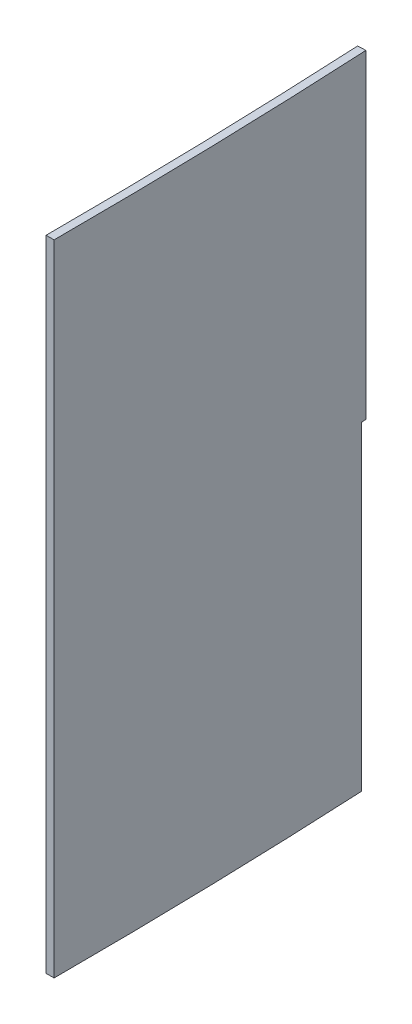
ISO-10303-21;
HEADER;
FILE_DESCRIPTION(('STEP AP214'),'2;1');
FILE_NAME('part.step','',(''),(''),'','','');
FILE_SCHEMA(('AUTOMOTIVE_DESIGN { 1 0 10303 214 1 1 1 1 }'));
ENDSEC;
DATA;
#1=APPLICATION_CONTEXT('core data for automotive mechanical design processes');
#2=APPLICATION_PROTOCOL_DEFINITION('international standard','automotive_design',2000,#1);
#3=PRODUCT_CONTEXT('',#1,'mechanical');
#4=PRODUCT('Part','Part','',(#3));
#5=PRODUCT_RELATED_PRODUCT_CATEGORY('part','',(#4));
#6=PRODUCT_DEFINITION_FORMATION('','',#4);
#7=PRODUCT_DEFINITION_CONTEXT('part definition',#1,'design');
#8=PRODUCT_DEFINITION('design','',#6,#7);
#9=PRODUCT_DEFINITION_SHAPE('','',#8);
#10=(LENGTH_UNIT() NAMED_UNIT(*) SI_UNIT(.MILLI.,.METRE.));
#11=(NAMED_UNIT(*) PLANE_ANGLE_UNIT() SI_UNIT($,.RADIAN.));
#12=(NAMED_UNIT(*) SI_UNIT($,.STERADIAN.) SOLID_ANGLE_UNIT());
#13=UNCERTAINTY_MEASURE_WITH_UNIT(LENGTH_MEASURE(1.E-05),#10,'distance_accuracy_value','');
#14=(GEOMETRIC_REPRESENTATION_CONTEXT(3) GLOBAL_UNCERTAINTY_ASSIGNED_CONTEXT((#13)) GLOBAL_UNIT_ASSIGNED_CONTEXT((#10,
#11,#12)) REPRESENTATION_CONTEXT('',''));
#15=CARTESIAN_POINT('',(0.,0.,0.));
#16=DIRECTION('',(0.,0.,1.));
#17=DIRECTION('',(1.,0.,0.));
#18=AXIS2_PLACEMENT_3D('',#15,#16,#17);
#19=CARTESIAN_POINT('',(0.,10.,0.));
#20=DIRECTION('',(0.,1.,0.));
#21=DIRECTION('',(0.,0.,1.));
#22=AXIS2_PLACEMENT_3D('',#19,#20,#21);
#23=PLANE('',#22);
#24=DIRECTION('',(-0.998690936139058,0.,0.0511508951406651));
#25=VECTOR('',#24,1.);
#26=CARTESIAN_POINT('',(195.244078015186,10.,-10.));
#27=LINE('',#26,#25);
#28=CARTESIAN_POINT('',(195.493750749221,10.,-10.0127877237851));
#29=VERTEX_POINT('',#28);
#30=CARTESIAN_POINT('',(195.244078015186,10.,-10.));
#31=VERTEX_POINT('',#30);
#32=EDGE_CURVE('E11',#29,#31,#27,.T.);
#33=ORIENTED_EDGE('',*,*,#32,.F.);
#34=CARTESIAN_POINT('',(0.,10.,0.));
#35=DIRECTION('',(0.,-1.,0.));
#36=DIRECTION('',(0.,0.,-1.));
#37=AXIS2_PLACEMENT_3D('',#34,#35,#36);
#38=CIRCLE('',#37,195.75);
#39=CARTESIAN_POINT('',(195.50137081598,10.,-9.86288543341248));
#40=VERTEX_POINT('',#39);
#41=EDGE_CURVE('E81',#29,#40,#38,.T.);
#42=ORIENTED_EDGE('',*,*,#41,.T.);
#43=DIRECTION('',(-0.998729863683168,0.,0.050385110770945));
#44=VECTOR('',#43,1.);
#45=CARTESIAN_POINT('',(195.251688350059,10.,-9.85028915571977));
#46=LINE('',#45,#44);
#47=CARTESIAN_POINT('',(195.251688350059,10.,-9.85028915571977));
#48=VERTEX_POINT('',#47);
#49=EDGE_CURVE('E49',#40,#48,#46,.T.);
#50=ORIENTED_EDGE('',*,*,#49,.T.);
#51=CARTESIAN_POINT('',(0.,10.,0.));
#52=DIRECTION('',(0.,-1.,0.));
#53=DIRECTION('',(0.,0.,1.));
#54=AXIS2_PLACEMENT_3D('',#51,#52,#53);
#55=CIRCLE('',#54,195.5);
#56=EDGE_CURVE('E84',#31,#48,#55,.T.);
#57=ORIENTED_EDGE('',*,*,#56,.F.);
#58=EDGE_LOOP('',(#33,#42,#50,#57));
#59=FACE_BOUND('',#58,.T.);
#60=ADVANCED_FACE('F39',(#59),#23,.F.);
#61=CARTESIAN_POINT('',(195.251688350059,5.,-9.85028915571976));
#62=DIRECTION('',(0.050385110770945,0.,0.998729863683168));
#63=DIRECTION('',(0.,-1.,0.));
#64=AXIS2_PLACEMENT_3D('',#61,#62,#63);
#65=PLANE('',#64);
#66=ORIENTED_EDGE('',*,*,#49,.F.);
#67=DIRECTION('',(0.,-1.,0.));
#68=VECTOR('',#67,1.);
#69=CARTESIAN_POINT('',(195.50137081598,32.3668921744843,-9.86288543341248));
#70=LINE('',#69,#68);
#71=CARTESIAN_POINT('',(195.50137081598,0.,-9.86288543341248));
#72=VERTEX_POINT('',#71);
#73=EDGE_CURVE('E97',#40,#72,#70,.T.);
#74=ORIENTED_EDGE('',*,*,#73,.T.);
#75=DIRECTION('',(-0.998729863683168,0.,0.050385110770945));
#76=VECTOR('',#75,1.);
#77=CARTESIAN_POINT('',(195.251688350059,0.,-9.85028915571976));
#78=LINE('',#77,#76);
#79=CARTESIAN_POINT('',(195.251688350059,0.,-9.85028915571976));
#80=VERTEX_POINT('',#79);
#81=EDGE_CURVE('E112',#72,#80,#78,.T.);
#82=ORIENTED_EDGE('',*,*,#81,.T.);
#83=DIRECTION('',(0.,-1.,0.));
#84=VECTOR('',#83,1.);
#85=CARTESIAN_POINT('',(195.251688350059,0.,-9.85028915571976));
#86=LINE('',#85,#84);
#87=EDGE_CURVE('E101',#48,#80,#86,.T.);
#88=ORIENTED_EDGE('',*,*,#87,.F.);
#89=EDGE_LOOP('',(#66,#74,#82,#88));
#90=FACE_BOUND('',#89,.T.);
#91=ADVANCED_FACE('F126',(#90),#65,.F.);
#92=CARTESIAN_POINT('',(0.,0.,0.));
#93=DIRECTION('',(0.,1.,0.));
#94=DIRECTION('',(0.,0.,1.));
#95=AXIS2_PLACEMENT_3D('',#92,#93,#94);
#96=PLANE('',#95);
#97=ORIENTED_EDGE('',*,*,#81,.F.);
#98=CARTESIAN_POINT('',(0.,0.,0.));
#99=DIRECTION('',(0.,-1.,0.));
#100=DIRECTION('',(0.,0.,-1.));
#101=AXIS2_PLACEMENT_3D('',#98,#99,#100);
#102=CIRCLE('',#101,195.75);
#103=CARTESIAN_POINT('',(195.75,0.,0.));
#104=VERTEX_POINT('',#103);
#105=EDGE_CURVE('E139',#72,#104,#102,.T.);
#106=ORIENTED_EDGE('',*,*,#105,.T.);
#107=DIRECTION('',(-1.,0.,0.));
#108=VECTOR('',#107,1.);
#109=CARTESIAN_POINT('',(195.5,0.,0.));
#110=LINE('',#109,#108);
#111=CARTESIAN_POINT('',(195.5,0.,0.));
#112=VERTEX_POINT('',#111);
#113=EDGE_CURVE('E109',#104,#112,#110,.T.);
#114=ORIENTED_EDGE('',*,*,#113,.T.);
#115=CARTESIAN_POINT('',(0.,0.,0.));
#116=DIRECTION('',(0.,-1.,0.));
#117=DIRECTION('',(0.,0.,-1.));
#118=AXIS2_PLACEMENT_3D('',#115,#116,#117);
#119=CIRCLE('',#118,195.5);
#120=EDGE_CURVE('E127',#80,#112,#119,.T.);
#121=ORIENTED_EDGE('',*,*,#120,.F.);
#122=EDGE_LOOP('',(#97,#106,#114,#121));
#123=FACE_BOUND('',#122,.T.);
#124=ADVANCED_FACE('F142',(#123),#96,.F.);
#125=CARTESIAN_POINT('',(195.5,10.,0.));
#126=DIRECTION('',(0.,0.,-1.));
#127=DIRECTION('',(0.,1.,0.));
#128=AXIS2_PLACEMENT_3D('',#125,#126,#127);
#129=PLANE('',#128);
#130=ORIENTED_EDGE('',*,*,#113,.F.);
#131=DIRECTION('',(0.,-1.,0.));
#132=VECTOR('',#131,1.);
#133=CARTESIAN_POINT('',(195.75,32.3668921744843,0.));
#134=LINE('',#133,#132);
#135=CARTESIAN_POINT('',(195.75,20.,0.));
#136=VERTEX_POINT('',#135);
#137=EDGE_CURVE('E103',#104,#136,#134,.F.);
#138=ORIENTED_EDGE('',*,*,#137,.T.);
#139=DIRECTION('',(-1.,0.,0.));
#140=VECTOR('',#139,1.);
#141=CARTESIAN_POINT('',(195.5,20.,0.));
#142=LINE('',#141,#140);
#143=CARTESIAN_POINT('',(195.5,20.,0.));
#144=VERTEX_POINT('',#143);
#145=EDGE_CURVE('E107',#136,#144,#142,.T.);
#146=ORIENTED_EDGE('',*,*,#145,.T.);
#147=DIRECTION('',(0.,1.,0.));
#148=VECTOR('',#147,1.);
#149=CARTESIAN_POINT('',(195.5,0.,0.));
#150=LINE('',#149,#148);
#151=EDGE_CURVE('E129',#112,#144,#150,.T.);
#152=ORIENTED_EDGE('',*,*,#151,.F.);
#153=EDGE_LOOP('',(#130,#138,#146,#152));
#154=FACE_BOUND('',#153,.T.);
#155=ADVANCED_FACE('F145',(#154),#129,.F.);
#156=CARTESIAN_POINT('',(0.,20.,0.));
#157=DIRECTION('',(0.,-1.,0.));
#158=DIRECTION('',(0.,0.,-1.));
#159=AXIS2_PLACEMENT_3D('',#156,#157,#158);
#160=PLANE('',#159);
#161=ORIENTED_EDGE('',*,*,#145,.F.);
#162=CARTESIAN_POINT('',(0.,20.,0.));
#163=DIRECTION('',(0.,-1.,0.));
#164=DIRECTION('',(0.,0.,-1.));
#165=AXIS2_PLACEMENT_3D('',#162,#163,#164);
#166=CIRCLE('',#165,195.75);
#167=CARTESIAN_POINT('',(195.493750749221,20.,-10.0127877237851));
#168=VERTEX_POINT('',#167);
#169=EDGE_CURVE('E99',#136,#168,#166,.F.);
#170=ORIENTED_EDGE('',*,*,#169,.T.);
#171=DIRECTION('',(-0.998690936139058,0.,0.0511508951406649));
#172=VECTOR('',#171,1.);
#173=CARTESIAN_POINT('',(195.244078015186,20.,-10.));
#174=LINE('',#173,#172);
#175=CARTESIAN_POINT('',(195.244078015186,20.,-10.));
#176=VERTEX_POINT('',#175);
#177=EDGE_CURVE('E43',#168,#176,#174,.T.);
#178=ORIENTED_EDGE('',*,*,#177,.T.);
#179=CARTESIAN_POINT('',(0.,20.,0.));
#180=DIRECTION('',(0.,1.,0.));
#181=DIRECTION('',(0.,0.,1.));
#182=AXIS2_PLACEMENT_3D('',#179,#180,#181);
#183=CIRCLE('',#182,195.5);
#184=EDGE_CURVE('E134',#144,#176,#183,.T.);
#185=ORIENTED_EDGE('',*,*,#184,.F.);
#186=EDGE_LOOP('',(#161,#170,#178,#185));
#187=FACE_BOUND('',#186,.T.);
#188=ADVANCED_FACE('F147',(#187),#160,.F.);
#189=CARTESIAN_POINT('',(195.244078015186,15.,-9.99999999999998));
#190=DIRECTION('',(0.0511508951406648,0.,0.998690936139058));
#191=DIRECTION('',(0.,-1.,0.));
#192=AXIS2_PLACEMENT_3D('',#189,#190,#191);
#193=PLANE('',#192);
#194=DIRECTION('',(0.,-1.,0.));
#195=VECTOR('',#194,1.);
#196=CARTESIAN_POINT('',(195.493750749221,32.3668921744843,-10.0127877237851));
#197=LINE('',#196,#195);
#198=EDGE_CURVE('E94',#168,#29,#197,.T.);
#199=ORIENTED_EDGE('',*,*,#198,.T.);
#200=ORIENTED_EDGE('',*,*,#32,.T.);
#201=DIRECTION('',(0.,-1.,0.));
#202=VECTOR('',#201,1.);
#203=CARTESIAN_POINT('',(195.244078015186,20.,-9.99999999999998));
#204=LINE('',#203,#202);
#205=EDGE_CURVE('E125',#176,#31,#204,.T.);
#206=ORIENTED_EDGE('',*,*,#205,.F.);
#207=ORIENTED_EDGE('',*,*,#177,.F.);
#208=EDGE_LOOP('',(#199,#200,#206,#207));
#209=FACE_BOUND('',#208,.T.);
#210=ADVANCED_FACE('F41',(#209),#193,.F.);
#211=CARTESIAN_POINT('',(0.,32.3668921744843,0.));
#212=DIRECTION('',(0.,-1.,0.));
#213=DIRECTION('',(0.,0.,-1.));
#214=AXIS2_PLACEMENT_3D('',#211,#212,#213);
#215=CYLINDRICAL_SURFACE('',#214,195.5);
#216=ORIENTED_EDGE('',*,*,#184,.T.);
#217=ORIENTED_EDGE('',*,*,#205,.T.);
#218=ORIENTED_EDGE('',*,*,#56,.T.);
#219=ORIENTED_EDGE('',*,*,#87,.T.);
#220=ORIENTED_EDGE('',*,*,#120,.T.);
#221=ORIENTED_EDGE('',*,*,#151,.T.);
#222=EDGE_LOOP('',(#216,#217,#218,#219,#220,#221));
#223=FACE_BOUND('',#222,.T.);
#224=ADVANCED_FACE('F122',(#223),#215,.F.);
#225=CARTESIAN_POINT('',(0.,32.3668921744843,0.));
#226=DIRECTION('',(0.,-1.,0.));
#227=DIRECTION('',(0.,0.,-1.));
#228=AXIS2_PLACEMENT_3D('',#225,#226,#227);
#229=CYLINDRICAL_SURFACE('',#228,195.75);
#230=ORIENTED_EDGE('',*,*,#169,.F.);
#231=ORIENTED_EDGE('',*,*,#137,.F.);
#232=ORIENTED_EDGE('',*,*,#105,.F.);
#233=ORIENTED_EDGE('',*,*,#73,.F.);
#234=ORIENTED_EDGE('',*,*,#41,.F.);
#235=ORIENTED_EDGE('',*,*,#198,.F.);
#236=EDGE_LOOP('',(#230,#231,#232,#233,#234,#235));
#237=FACE_BOUND('',#236,.T.);
#238=ADVANCED_FACE('F93',(#237),#229,.T.);
#239=CLOSED_SHELL('',(#60,#91,#124,#155,#188,#210,#224,#238));
#240=MANIFOLD_SOLID_BREP('B2',#239);
#241=ADVANCED_BREP_SHAPE_REPRESENTATION('',(#18,#240),#14);
#242=SHAPE_DEFINITION_REPRESENTATION(#9,#241);
ENDSEC;
END-ISO-10303-21;
